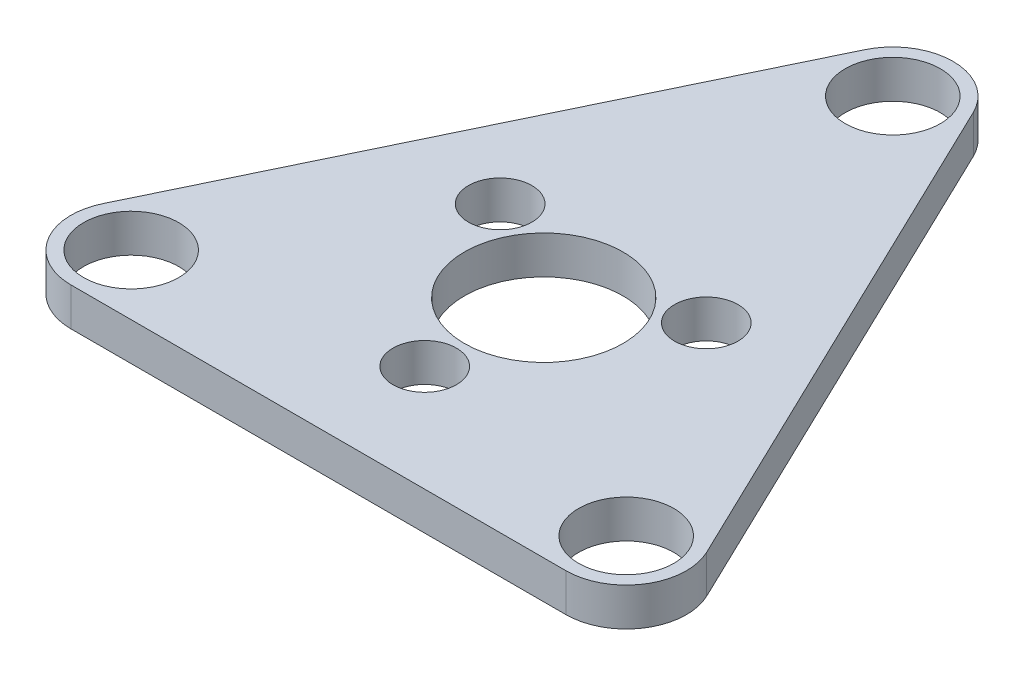
ISO-10303-21;
HEADER;
FILE_DESCRIPTION(('STEP AP214'),'2;1');
FILE_NAME('part.step','',(''),(''),'','','');
FILE_SCHEMA(('AUTOMOTIVE_DESIGN { 1 0 10303 214 1 1 1 1 }'));
ENDSEC;
DATA;
#1=APPLICATION_CONTEXT('core data for automotive mechanical design processes');
#2=APPLICATION_PROTOCOL_DEFINITION('international standard','automotive_design',2000,#1);
#3=PRODUCT_CONTEXT('',#1,'mechanical');
#4=PRODUCT('Part','Part','',(#3));
#5=PRODUCT_RELATED_PRODUCT_CATEGORY('part','',(#4));
#6=PRODUCT_DEFINITION_FORMATION('','',#4);
#7=PRODUCT_DEFINITION_CONTEXT('part definition',#1,'design');
#8=PRODUCT_DEFINITION('design','',#6,#7);
#9=PRODUCT_DEFINITION_SHAPE('','',#8);
#10=(LENGTH_UNIT() NAMED_UNIT(*) SI_UNIT(.MILLI.,.METRE.));
#11=(NAMED_UNIT(*) PLANE_ANGLE_UNIT() SI_UNIT($,.RADIAN.));
#12=(NAMED_UNIT(*) SI_UNIT($,.STERADIAN.) SOLID_ANGLE_UNIT());
#13=UNCERTAINTY_MEASURE_WITH_UNIT(LENGTH_MEASURE(1.E-05),#10,'distance_accuracy_value','');
#14=(GEOMETRIC_REPRESENTATION_CONTEXT(3) GLOBAL_UNCERTAINTY_ASSIGNED_CONTEXT((#13)) GLOBAL_UNIT_ASSIGNED_CONTEXT((#10,
#11,#12)) REPRESENTATION_CONTEXT('',''));
#15=CARTESIAN_POINT('',(0.,0.,0.));
#16=DIRECTION('',(0.,0.,1.));
#17=DIRECTION('',(1.,0.,0.));
#18=AXIS2_PLACEMENT_3D('',#15,#16,#17);
#19=CARTESIAN_POINT('',(0.,6.,-110.));
#20=DIRECTION('',(0.,1.,0.));
#21=DIRECTION('',(0.,0.,1.));
#22=AXIS2_PLACEMENT_3D('',#19,#20,#21);
#23=PLANE('',#22);
#24=CARTESIAN_POINT('',(32.4759526419166,6.,-18.7499999999997));
#25=DIRECTION('',(0.,1.,0.));
#26=DIRECTION('',(0.,0.,1.));
#27=AXIS2_PLACEMENT_3D('',#24,#25,#26);
#28=CIRCLE('',#27,10.);
#29=CARTESIAN_POINT('',(32.4759526419166,6.,-8.74999999999968));
#30=VERTEX_POINT('',#29);
#31=EDGE_CURVE('E222',#30,#30,#28,.T.);
#32=ORIENTED_EDGE('',*,*,#31,.F.);
#33=EDGE_LOOP('',(#32));
#34=FACE_BOUND('',#33,.T.);
#35=CARTESIAN_POINT('',(-32.4759526419164,6.,-18.7500000000002));
#36=DIRECTION('',(0.,1.,0.));
#37=DIRECTION('',(0.,0.,1.));
#38=AXIS2_PLACEMENT_3D('',#35,#36,#37);
#39=CIRCLE('',#38,10.);
#40=CARTESIAN_POINT('',(-32.4759526419164,6.,-8.75000000000014));
#41=VERTEX_POINT('',#40);
#42=EDGE_CURVE('E226',#41,#41,#39,.T.);
#43=ORIENTED_EDGE('',*,*,#42,.F.);
#44=EDGE_LOOP('',(#43));
#45=FACE_BOUND('',#44,.T.);
#46=CARTESIAN_POINT('',(0.,6.,37.5));
#47=DIRECTION('',(0.,1.,0.));
#48=DIRECTION('',(0.,0.,1.));
#49=AXIS2_PLACEMENT_3D('',#46,#47,#48);
#50=CIRCLE('',#49,10.);
#51=CARTESIAN_POINT('',(0.,6.,47.5));
#52=VERTEX_POINT('',#51);
#53=EDGE_CURVE('E236',#52,#52,#50,.T.);
#54=ORIENTED_EDGE('',*,*,#53,.F.);
#55=EDGE_LOOP('',(#54));
#56=FACE_BOUND('',#55,.T.);
#57=CARTESIAN_POINT('',(78.,6.,52.));
#58=DIRECTION('',(0.,1.,0.));
#59=DIRECTION('',(0.,0.,1.));
#60=AXIS2_PLACEMENT_3D('',#57,#58,#59);
#61=CIRCLE('',#60,15.);
#62=CARTESIAN_POINT('',(78.,6.,67.));
#63=VERTEX_POINT('',#62);
#64=EDGE_CURVE('E253',#63,#63,#61,.T.);
#65=ORIENTED_EDGE('',*,*,#64,.F.);
#66=EDGE_LOOP('',(#65));
#67=FACE_BOUND('',#66,.T.);
#68=CARTESIAN_POINT('',(0.,6.,-110.));
#69=DIRECTION('',(0.,1.,0.));
#70=DIRECTION('',(0.,0.,1.));
#71=AXIS2_PLACEMENT_3D('',#68,#69,#70);
#72=CIRCLE('',#71,15.);
#73=CARTESIAN_POINT('',(0.,6.,-95.));
#74=VERTEX_POINT('',#73);
#75=EDGE_CURVE('E140',#74,#74,#72,.T.);
#76=ORIENTED_EDGE('',*,*,#75,.F.);
#77=EDGE_LOOP('',(#76));
#78=FACE_BOUND('',#77,.T.);
#79=CARTESIAN_POINT('',(0.,6.,-110.));
#80=DIRECTION('',(0.,1.,0.));
#81=DIRECTION('',(0.,0.,1.));
#82=AXIS2_PLACEMENT_3D('',#79,#80,#81);
#83=CIRCLE('',#82,19.);
#84=CARTESIAN_POINT('',(17.1190317254229,6.,-118.242496756685));
#85=VERTEX_POINT('',#84);
#86=CARTESIAN_POINT('',(-17.1190317254229,6.,-118.242496756685));
#87=VERTEX_POINT('',#86);
#88=EDGE_CURVE('E152',#85,#87,#83,.T.);
#89=ORIENTED_EDGE('',*,*,#88,.T.);
#90=DIRECTION('',(-0.4338156187729,0.,0.9010016697591));
#91=VECTOR('',#90,1.);
#92=CARTESIAN_POINT('',(-95.1190317254229,6.,43.7575032433149));
#93=LINE('',#92,#91);
#94=CARTESIAN_POINT('',(-95.1190317254229,6.,43.7575032433149));
#95=VERTEX_POINT('',#94);
#96=EDGE_CURVE('E100',#87,#95,#93,.T.);
#97=ORIENTED_EDGE('',*,*,#96,.T.);
#98=CARTESIAN_POINT('',(-78.,6.,52.));
#99=DIRECTION('',(0.,1.,0.));
#100=DIRECTION('',(0.,0.,1.));
#101=AXIS2_PLACEMENT_3D('',#98,#99,#100);
#102=CIRCLE('',#101,19.);
#103=CARTESIAN_POINT('',(-78.,6.,71.));
#104=VERTEX_POINT('',#103);
#105=EDGE_CURVE('E113',#95,#104,#102,.T.);
#106=ORIENTED_EDGE('',*,*,#105,.T.);
#107=DIRECTION('',(1.,0.,0.));
#108=VECTOR('',#107,1.);
#109=CARTESIAN_POINT('',(-78.,6.,71.));
#110=LINE('',#109,#108);
#111=CARTESIAN_POINT('',(78.,6.,71.));
#112=VERTEX_POINT('',#111);
#113=EDGE_CURVE('E107',#104,#112,#110,.T.);
#114=ORIENTED_EDGE('',*,*,#113,.T.);
#115=CARTESIAN_POINT('',(78.,6.,52.));
#116=DIRECTION('',(0.,1.,0.));
#117=DIRECTION('',(0.,0.,-1.));
#118=AXIS2_PLACEMENT_3D('',#115,#116,#117);
#119=CIRCLE('',#118,19.);
#120=CARTESIAN_POINT('',(95.1190317254229,6.,43.7575032433149));
#121=VERTEX_POINT('',#120);
#122=EDGE_CURVE('E111',#112,#121,#119,.T.);
#123=ORIENTED_EDGE('',*,*,#122,.T.);
#124=DIRECTION('',(-0.4338156187729,0.,-0.9010016697591));
#125=VECTOR('',#124,1.);
#126=CARTESIAN_POINT('',(95.1190317254229,6.,43.7575032433149));
#127=LINE('',#126,#125);
#128=EDGE_CURVE('E63',#121,#85,#127,.T.);
#129=ORIENTED_EDGE('',*,*,#128,.T.);
#130=EDGE_LOOP('',(#89,#97,#106,#114,#123,#129));
#131=FACE_BOUND('',#130,.T.);
#132=CARTESIAN_POINT('',(-78.,6.,52.));
#133=DIRECTION('',(0.,1.,0.));
#134=DIRECTION('',(0.,0.,1.));
#135=AXIS2_PLACEMENT_3D('',#132,#133,#134);
#136=CIRCLE('',#135,15.);
#137=CARTESIAN_POINT('',(-78.,6.,67.));
#138=VERTEX_POINT('',#137);
#139=EDGE_CURVE('E261',#138,#138,#136,.T.);
#140=ORIENTED_EDGE('',*,*,#139,.F.);
#141=EDGE_LOOP('',(#140));
#142=FACE_BOUND('',#141,.T.);
#143=CARTESIAN_POINT('',(0.,6.,0.));
#144=DIRECTION('',(0.,1.,0.));
#145=DIRECTION('',(0.,0.,1.));
#146=AXIS2_PLACEMENT_3D('',#143,#144,#145);
#147=CIRCLE('',#146,25.);
#148=CARTESIAN_POINT('',(0.,6.,25.));
#149=VERTEX_POINT('',#148);
#150=EDGE_CURVE('E245',#149,#149,#147,.T.);
#151=ORIENTED_EDGE('',*,*,#150,.F.);
#152=EDGE_LOOP('',(#151));
#153=FACE_BOUND('',#152,.T.);
#154=ADVANCED_FACE('F45',(#34,#45,#56,#67,#78,#131,#142,#153),#23,.T.);
#155=CARTESIAN_POINT('',(0.,-6.,-110.));
#156=DIRECTION('',(0.,1.,0.));
#157=DIRECTION('',(0.,0.,1.));
#158=AXIS2_PLACEMENT_3D('',#155,#156,#157);
#159=PLANE('',#158);
#160=CARTESIAN_POINT('',(32.4759526419166,-6.,-18.7499999999997));
#161=DIRECTION('',(0.,1.,0.));
#162=DIRECTION('',(0.,0.,1.));
#163=AXIS2_PLACEMENT_3D('',#160,#161,#162);
#164=CIRCLE('',#163,10.);
#165=CARTESIAN_POINT('',(32.4759526419166,-6.,-8.74999999999969));
#166=VERTEX_POINT('',#165);
#167=EDGE_CURVE('E220',#166,#166,#164,.T.);
#168=ORIENTED_EDGE('',*,*,#167,.T.);
#169=EDGE_LOOP('',(#168));
#170=FACE_BOUND('',#169,.T.);
#171=CARTESIAN_POINT('',(-32.4759526419164,-6.,-18.7500000000002));
#172=DIRECTION('',(0.,1.,0.));
#173=DIRECTION('',(0.,0.,1.));
#174=AXIS2_PLACEMENT_3D('',#171,#172,#173);
#175=CIRCLE('',#174,10.);
#176=CARTESIAN_POINT('',(-32.4759526419164,-6.,-8.75000000000014));
#177=VERTEX_POINT('',#176);
#178=EDGE_CURVE('E232',#177,#177,#175,.T.);
#179=ORIENTED_EDGE('',*,*,#178,.T.);
#180=EDGE_LOOP('',(#179));
#181=FACE_BOUND('',#180,.T.);
#182=CARTESIAN_POINT('',(0.,-6.,37.5));
#183=DIRECTION('',(0.,1.,0.));
#184=DIRECTION('',(0.,0.,1.));
#185=AXIS2_PLACEMENT_3D('',#182,#183,#184);
#186=CIRCLE('',#185,10.);
#187=CARTESIAN_POINT('',(0.,-6.,47.5));
#188=VERTEX_POINT('',#187);
#189=EDGE_CURVE('E240',#188,#188,#186,.T.);
#190=ORIENTED_EDGE('',*,*,#189,.T.);
#191=EDGE_LOOP('',(#190));
#192=FACE_BOUND('',#191,.T.);
#193=CARTESIAN_POINT('',(0.,-6.,-110.));
#194=DIRECTION('',(0.,1.,0.));
#195=DIRECTION('',(0.,0.,1.));
#196=AXIS2_PLACEMENT_3D('',#193,#194,#195);
#197=CIRCLE('',#196,19.);
#198=CARTESIAN_POINT('',(17.1190317254229,-6.,-118.242496756685));
#199=VERTEX_POINT('',#198);
#200=CARTESIAN_POINT('',(-17.1190317254229,-6.,-118.242496756685));
#201=VERTEX_POINT('',#200);
#202=EDGE_CURVE('E135',#199,#201,#197,.T.);
#203=ORIENTED_EDGE('',*,*,#202,.F.);
#204=DIRECTION('',(-0.4338156187729,0.,-0.9010016697591));
#205=VECTOR('',#204,1.);
#206=CARTESIAN_POINT('',(95.1190317254229,-6.,43.7575032433149));
#207=LINE('',#206,#205);
#208=CARTESIAN_POINT('',(95.1190317254229,-6.,43.7575032433149));
#209=VERTEX_POINT('',#208);
#210=EDGE_CURVE('E92',#209,#199,#207,.T.);
#211=ORIENTED_EDGE('',*,*,#210,.F.);
#212=CARTESIAN_POINT('',(78.,-6.,52.));
#213=DIRECTION('',(0.,1.,0.));
#214=DIRECTION('',(0.,0.,-1.));
#215=AXIS2_PLACEMENT_3D('',#212,#213,#214);
#216=CIRCLE('',#215,19.);
#217=CARTESIAN_POINT('',(78.,-6.,71.));
#218=VERTEX_POINT('',#217);
#219=EDGE_CURVE('E86',#218,#209,#216,.T.);
#220=ORIENTED_EDGE('',*,*,#219,.F.);
#221=DIRECTION('',(1.,0.,0.));
#222=VECTOR('',#221,1.);
#223=CARTESIAN_POINT('',(-78.,-6.,71.));
#224=LINE('',#223,#222);
#225=CARTESIAN_POINT('',(-78.,-6.,71.));
#226=VERTEX_POINT('',#225);
#227=EDGE_CURVE('E122',#226,#218,#224,.T.);
#228=ORIENTED_EDGE('',*,*,#227,.F.);
#229=CARTESIAN_POINT('',(-78.,-6.,52.));
#230=DIRECTION('',(0.,1.,0.));
#231=DIRECTION('',(0.,0.,1.));
#232=AXIS2_PLACEMENT_3D('',#229,#230,#231);
#233=CIRCLE('',#232,19.);
#234=CARTESIAN_POINT('',(-95.1190317254229,-6.,43.7575032433149));
#235=VERTEX_POINT('',#234);
#236=EDGE_CURVE('E143',#235,#226,#233,.T.);
#237=ORIENTED_EDGE('',*,*,#236,.F.);
#238=DIRECTION('',(-0.4338156187729,0.,0.9010016697591));
#239=VECTOR('',#238,1.);
#240=CARTESIAN_POINT('',(-95.1190317254229,-6.,43.7575032433149));
#241=LINE('',#240,#239);
#242=EDGE_CURVE('E139',#201,#235,#241,.T.);
#243=ORIENTED_EDGE('',*,*,#242,.F.);
#244=EDGE_LOOP('',(#203,#211,#220,#228,#237,#243));
#245=FACE_BOUND('',#244,.T.);
#246=CARTESIAN_POINT('',(0.,-6.,-110.));
#247=DIRECTION('',(0.,1.,0.));
#248=DIRECTION('',(0.,0.,1.));
#249=AXIS2_PLACEMENT_3D('',#246,#247,#248);
#250=CIRCLE('',#249,15.);
#251=CARTESIAN_POINT('',(0.,-6.,-95.));
#252=VERTEX_POINT('',#251);
#253=EDGE_CURVE('E265',#252,#252,#250,.T.);
#254=ORIENTED_EDGE('',*,*,#253,.T.);
#255=EDGE_LOOP('',(#254));
#256=FACE_BOUND('',#255,.T.);
#257=CARTESIAN_POINT('',(-78.,-6.,52.));
#258=DIRECTION('',(0.,1.,0.));
#259=DIRECTION('',(0.,0.,1.));
#260=AXIS2_PLACEMENT_3D('',#257,#258,#259);
#261=CIRCLE('',#260,15.);
#262=CARTESIAN_POINT('',(-78.,-6.,67.));
#263=VERTEX_POINT('',#262);
#264=EDGE_CURVE('E257',#263,#263,#261,.T.);
#265=ORIENTED_EDGE('',*,*,#264,.T.);
#266=EDGE_LOOP('',(#265));
#267=FACE_BOUND('',#266,.T.);
#268=CARTESIAN_POINT('',(78.,-6.,52.));
#269=DIRECTION('',(0.,1.,0.));
#270=DIRECTION('',(0.,0.,1.));
#271=AXIS2_PLACEMENT_3D('',#268,#269,#270);
#272=CIRCLE('',#271,15.);
#273=CARTESIAN_POINT('',(78.,-6.,67.));
#274=VERTEX_POINT('',#273);
#275=EDGE_CURVE('E249',#274,#274,#272,.T.);
#276=ORIENTED_EDGE('',*,*,#275,.T.);
#277=EDGE_LOOP('',(#276));
#278=FACE_BOUND('',#277,.T.);
#279=CARTESIAN_POINT('',(0.,-6.,0.));
#280=DIRECTION('',(0.,1.,0.));
#281=DIRECTION('',(0.,0.,1.));
#282=AXIS2_PLACEMENT_3D('',#279,#280,#281);
#283=CIRCLE('',#282,25.);
#284=CARTESIAN_POINT('',(0.,-6.,25.));
#285=VERTEX_POINT('',#284);
#286=EDGE_CURVE('E244',#285,#285,#283,.T.);
#287=ORIENTED_EDGE('',*,*,#286,.T.);
#288=EDGE_LOOP('',(#287));
#289=FACE_BOUND('',#288,.T.);
#290=ADVANCED_FACE('F165',(#170,#181,#192,#245,#256,#267,#278,#289),#159,.F.);
#291=CARTESIAN_POINT('',(0.,6.,-110.));
#292=DIRECTION('',(0.,-1.,0.));
#293=DIRECTION('',(0.,0.,-1.));
#294=AXIS2_PLACEMENT_3D('',#291,#292,#293);
#295=CYLINDRICAL_SURFACE('',#294,19.);
#296=ORIENTED_EDGE('',*,*,#202,.T.);
#297=DIRECTION('',(0.,-1.,0.));
#298=VECTOR('',#297,1.);
#299=CARTESIAN_POINT('',(-17.1190317254229,6.,-118.242496756685));
#300=LINE('',#299,#298);
#301=EDGE_CURVE('E11',#87,#201,#300,.T.);
#302=ORIENTED_EDGE('',*,*,#301,.F.);
#303=ORIENTED_EDGE('',*,*,#88,.F.);
#304=DIRECTION('',(0.,-1.,0.));
#305=VECTOR('',#304,1.);
#306=CARTESIAN_POINT('',(17.1190317254229,6.,-118.242496756685));
#307=LINE('',#306,#305);
#308=EDGE_CURVE('E131',#85,#199,#307,.T.);
#309=ORIENTED_EDGE('',*,*,#308,.T.);
#310=EDGE_LOOP('',(#296,#302,#303,#309));
#311=FACE_BOUND('',#310,.T.);
#312=ADVANCED_FACE('F47',(#311),#295,.T.);
#313=CARTESIAN_POINT('',(-95.1190317254229,6.,43.7575032433149));
#314=DIRECTION('',(0.9010016697591,0.,0.4338156187729));
#315=DIRECTION('',(0.4338156187729,0.,-0.9010016697591));
#316=AXIS2_PLACEMENT_3D('',#313,#314,#315);
#317=PLANE('',#316);
#318=ORIENTED_EDGE('',*,*,#242,.T.);
#319=DIRECTION('',(0.,-1.,0.));
#320=VECTOR('',#319,1.);
#321=CARTESIAN_POINT('',(-95.1190317254229,6.,43.7575032433149));
#322=LINE('',#321,#320);
#323=EDGE_CURVE('E55',#95,#235,#322,.T.);
#324=ORIENTED_EDGE('',*,*,#323,.F.);
#325=ORIENTED_EDGE('',*,*,#96,.F.);
#326=ORIENTED_EDGE('',*,*,#301,.T.);
#327=EDGE_LOOP('',(#318,#324,#325,#326));
#328=FACE_BOUND('',#327,.T.);
#329=ADVANCED_FACE('F330',(#328),#317,.F.);
#330=CARTESIAN_POINT('',(-78.,6.,52.));
#331=DIRECTION('',(0.,-1.,0.));
#332=DIRECTION('',(0.,0.,-1.));
#333=AXIS2_PLACEMENT_3D('',#330,#331,#332);
#334=CYLINDRICAL_SURFACE('',#333,19.);
#335=ORIENTED_EDGE('',*,*,#236,.T.);
#336=DIRECTION('',(0.,-1.,0.));
#337=VECTOR('',#336,1.);
#338=CARTESIAN_POINT('',(-78.,6.,71.));
#339=LINE('',#338,#337);
#340=EDGE_CURVE('E124',#104,#226,#339,.T.);
#341=ORIENTED_EDGE('',*,*,#340,.F.);
#342=ORIENTED_EDGE('',*,*,#105,.F.);
#343=ORIENTED_EDGE('',*,*,#323,.T.);
#344=EDGE_LOOP('',(#335,#341,#342,#343));
#345=FACE_BOUND('',#344,.T.);
#346=ADVANCED_FACE('F162',(#345),#334,.T.);
#347=CARTESIAN_POINT('',(-78.,6.,71.));
#348=DIRECTION('',(0.,0.,-1.));
#349=DIRECTION('',(-1.,0.,0.));
#350=AXIS2_PLACEMENT_3D('',#347,#348,#349);
#351=PLANE('',#350);
#352=ORIENTED_EDGE('',*,*,#227,.T.);
#353=DIRECTION('',(0.,-1.,0.));
#354=VECTOR('',#353,1.);
#355=CARTESIAN_POINT('',(78.,6.,71.));
#356=LINE('',#355,#354);
#357=EDGE_CURVE('E119',#112,#218,#356,.T.);
#358=ORIENTED_EDGE('',*,*,#357,.F.);
#359=ORIENTED_EDGE('',*,*,#113,.F.);
#360=ORIENTED_EDGE('',*,*,#340,.T.);
#361=EDGE_LOOP('',(#352,#358,#359,#360));
#362=FACE_BOUND('',#361,.T.);
#363=ADVANCED_FACE('F120',(#362),#351,.F.);
#364=CARTESIAN_POINT('',(78.,6.,52.));
#365=DIRECTION('',(0.,-1.,0.));
#366=DIRECTION('',(0.,0.,-1.));
#367=AXIS2_PLACEMENT_3D('',#364,#365,#366);
#368=CYLINDRICAL_SURFACE('',#367,19.);
#369=ORIENTED_EDGE('',*,*,#219,.T.);
#370=DIRECTION('',(0.,-1.,0.));
#371=VECTOR('',#370,1.);
#372=CARTESIAN_POINT('',(95.1190317254229,6.,43.7575032433149));
#373=LINE('',#372,#371);
#374=EDGE_CURVE('E125',#121,#209,#373,.T.);
#375=ORIENTED_EDGE('',*,*,#374,.F.);
#376=ORIENTED_EDGE('',*,*,#122,.F.);
#377=ORIENTED_EDGE('',*,*,#357,.T.);
#378=EDGE_LOOP('',(#369,#375,#376,#377));
#379=FACE_BOUND('',#378,.T.);
#380=ADVANCED_FACE('F127',(#379),#368,.T.);
#381=CARTESIAN_POINT('',(95.1190317254229,6.,43.7575032433149));
#382=DIRECTION('',(-0.9010016697591,0.,0.4338156187729));
#383=DIRECTION('',(0.4338156187729,0.,0.9010016697591));
#384=AXIS2_PLACEMENT_3D('',#381,#382,#383);
#385=PLANE('',#384);
#386=ORIENTED_EDGE('',*,*,#210,.T.);
#387=ORIENTED_EDGE('',*,*,#308,.F.);
#388=ORIENTED_EDGE('',*,*,#128,.F.);
#389=ORIENTED_EDGE('',*,*,#374,.T.);
#390=EDGE_LOOP('',(#386,#387,#388,#389));
#391=FACE_BOUND('',#390,.T.);
#392=ADVANCED_FACE('F170',(#391),#385,.F.);
#393=CARTESIAN_POINT('',(0.,6.,-110.));
#394=DIRECTION('',(0.,-1.,0.));
#395=DIRECTION('',(0.,0.,-1.));
#396=AXIS2_PLACEMENT_3D('',#393,#394,#395);
#397=CYLINDRICAL_SURFACE('',#396,15.);
#398=ORIENTED_EDGE('',*,*,#75,.T.);
#399=EDGE_LOOP('',(#398));
#400=FACE_BOUND('',#399,.T.);
#401=ORIENTED_EDGE('',*,*,#253,.F.);
#402=EDGE_LOOP('',(#401));
#403=FACE_BOUND('',#402,.T.);
#404=ADVANCED_FACE('F172',(#400,#403),#397,.F.);
#405=CARTESIAN_POINT('',(-78.,6.,52.));
#406=DIRECTION('',(0.,-1.,0.));
#407=DIRECTION('',(0.,0.,-1.));
#408=AXIS2_PLACEMENT_3D('',#405,#406,#407);
#409=CYLINDRICAL_SURFACE('',#408,15.);
#410=ORIENTED_EDGE('',*,*,#139,.T.);
#411=EDGE_LOOP('',(#410));
#412=FACE_BOUND('',#411,.T.);
#413=ORIENTED_EDGE('',*,*,#264,.F.);
#414=EDGE_LOOP('',(#413));
#415=FACE_BOUND('',#414,.T.);
#416=ADVANCED_FACE('F178',(#412,#415),#409,.F.);
#417=CARTESIAN_POINT('',(78.,6.,52.));
#418=DIRECTION('',(0.,-1.,0.));
#419=DIRECTION('',(0.,0.,-1.));
#420=AXIS2_PLACEMENT_3D('',#417,#418,#419);
#421=CYLINDRICAL_SURFACE('',#420,15.);
#422=ORIENTED_EDGE('',*,*,#64,.T.);
#423=EDGE_LOOP('',(#422));
#424=FACE_BOUND('',#423,.T.);
#425=ORIENTED_EDGE('',*,*,#275,.F.);
#426=EDGE_LOOP('',(#425));
#427=FACE_BOUND('',#426,.T.);
#428=ADVANCED_FACE('F196',(#424,#427),#421,.F.);
#429=CARTESIAN_POINT('',(0.,6.,0.));
#430=DIRECTION('',(0.,-1.,0.));
#431=DIRECTION('',(0.,0.,-1.));
#432=AXIS2_PLACEMENT_3D('',#429,#430,#431);
#433=CYLINDRICAL_SURFACE('',#432,25.);
#434=ORIENTED_EDGE('',*,*,#150,.T.);
#435=EDGE_LOOP('',(#434));
#436=FACE_BOUND('',#435,.T.);
#437=ORIENTED_EDGE('',*,*,#286,.F.);
#438=EDGE_LOOP('',(#437));
#439=FACE_BOUND('',#438,.T.);
#440=ADVANCED_FACE('F200',(#436,#439),#433,.F.);
#441=CARTESIAN_POINT('',(0.,6.,37.5));
#442=DIRECTION('',(0.,1.,0.));
#443=DIRECTION('',(0.,0.,1.));
#444=AXIS2_PLACEMENT_3D('',#441,#442,#443);
#445=CYLINDRICAL_SURFACE('',#444,10.);
#446=ORIENTED_EDGE('',*,*,#189,.F.);
#447=EDGE_LOOP('',(#446));
#448=FACE_BOUND('',#447,.T.);
#449=ORIENTED_EDGE('',*,*,#53,.T.);
#450=EDGE_LOOP('',(#449));
#451=FACE_BOUND('',#450,.T.);
#452=ADVANCED_FACE('F204',(#448,#451),#445,.F.);
#453=CARTESIAN_POINT('',(-32.4759526419164,6.,-18.7500000000002));
#454=DIRECTION('',(0.,1.,0.));
#455=DIRECTION('',(0.,0.,1.));
#456=AXIS2_PLACEMENT_3D('',#453,#454,#455);
#457=CYLINDRICAL_SURFACE('',#456,10.);
#458=ORIENTED_EDGE('',*,*,#178,.F.);
#459=EDGE_LOOP('',(#458));
#460=FACE_BOUND('',#459,.T.);
#461=ORIENTED_EDGE('',*,*,#42,.T.);
#462=EDGE_LOOP('',(#461));
#463=FACE_BOUND('',#462,.T.);
#464=ADVANCED_FACE('F207',(#460,#463),#457,.F.);
#465=CARTESIAN_POINT('',(32.4759526419166,6.,-18.7499999999997));
#466=DIRECTION('',(0.,1.,0.));
#467=DIRECTION('',(0.,0.,1.));
#468=AXIS2_PLACEMENT_3D('',#465,#466,#467);
#469=CYLINDRICAL_SURFACE('',#468,10.);
#470=ORIENTED_EDGE('',*,*,#167,.F.);
#471=EDGE_LOOP('',(#470));
#472=FACE_BOUND('',#471,.T.);
#473=ORIENTED_EDGE('',*,*,#31,.T.);
#474=EDGE_LOOP('',(#473));
#475=FACE_BOUND('',#474,.T.);
#476=ADVANCED_FACE('F211',(#472,#475),#469,.F.);
#477=CLOSED_SHELL('',(#154,#290,#312,#329,#346,#363,#380,#392,#404,#416,#428,#440,#452,#464,#476));
#478=MANIFOLD_SOLID_BREP('B2',#477);
#479=ADVANCED_BREP_SHAPE_REPRESENTATION('',(#18,#478),#14);
#480=SHAPE_DEFINITION_REPRESENTATION(#9,#479);
ENDSEC;
END-ISO-10303-21;
